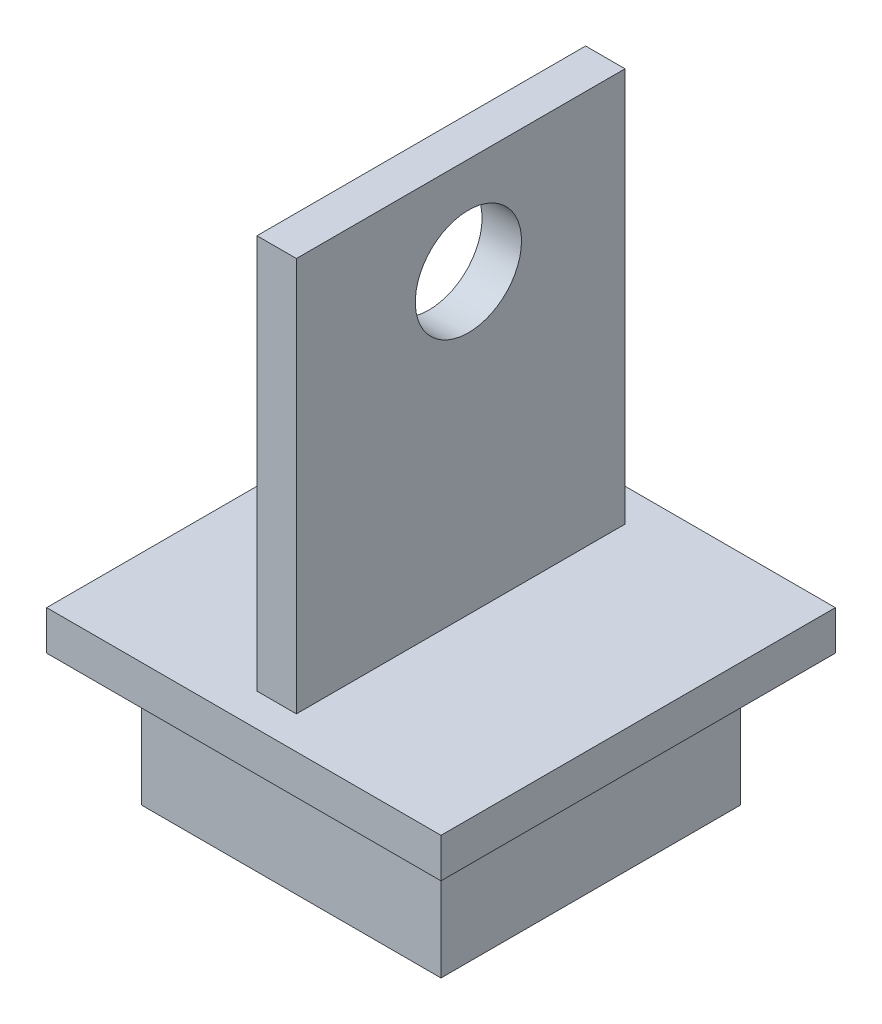
ISO-10303-21;
HEADER;
FILE_DESCRIPTION(('STEP AP214'),'2;1');
FILE_NAME('part.step','',(''),(''),'','','');
FILE_SCHEMA(('AUTOMOTIVE_DESIGN { 1 0 10303 214 1 1 1 1 }'));
ENDSEC;
DATA;
#1=APPLICATION_CONTEXT('core data for automotive mechanical design processes');
#2=APPLICATION_PROTOCOL_DEFINITION('international standard','automotive_design',2000,#1);
#3=PRODUCT_CONTEXT('',#1,'mechanical');
#4=PRODUCT('Part','Part','',(#3));
#5=PRODUCT_RELATED_PRODUCT_CATEGORY('part','',(#4));
#6=PRODUCT_DEFINITION_FORMATION('','',#4);
#7=PRODUCT_DEFINITION_CONTEXT('part definition',#1,'design');
#8=PRODUCT_DEFINITION('design','',#6,#7);
#9=PRODUCT_DEFINITION_SHAPE('','',#8);
#10=(LENGTH_UNIT() NAMED_UNIT(*) SI_UNIT(.MILLI.,.METRE.));
#11=(NAMED_UNIT(*) PLANE_ANGLE_UNIT() SI_UNIT($,.RADIAN.));
#12=(NAMED_UNIT(*) SI_UNIT($,.STERADIAN.) SOLID_ANGLE_UNIT());
#13=UNCERTAINTY_MEASURE_WITH_UNIT(LENGTH_MEASURE(1.E-05),#10,'distance_accuracy_value','');
#14=(GEOMETRIC_REPRESENTATION_CONTEXT(3) GLOBAL_UNCERTAINTY_ASSIGNED_CONTEXT((#13)) GLOBAL_UNIT_ASSIGNED_CONTEXT((#10,
#11,#12)) REPRESENTATION_CONTEXT('',''));
#15=CARTESIAN_POINT('',(0.,0.,0.));
#16=DIRECTION('',(0.,0.,1.));
#17=DIRECTION('',(1.,0.,0.));
#18=AXIS2_PLACEMENT_3D('',#15,#16,#17);
#19=CARTESIAN_POINT('',(0.,0.,0.));
#20=DIRECTION('',(0.,1.,0.));
#21=DIRECTION('',(0.,0.,1.));
#22=AXIS2_PLACEMENT_3D('',#19,#20,#21);
#23=PLANE('',#22);
#24=DIRECTION('',(0.,0.,-1.));
#25=VECTOR('',#24,1.);
#26=CARTESIAN_POINT('',(15.,0.,-15.));
#27=LINE('',#26,#25);
#28=CARTESIAN_POINT('',(15.,0.,15.));
#29=VERTEX_POINT('',#28);
#30=CARTESIAN_POINT('',(15.,0.,-15.));
#31=VERTEX_POINT('',#30);
#32=EDGE_CURVE('E249',#29,#31,#27,.T.);
#33=ORIENTED_EDGE('',*,*,#32,.F.);
#34=DIRECTION('',(1.,0.,0.));
#35=VECTOR('',#34,1.);
#36=CARTESIAN_POINT('',(-15.,0.,15.));
#37=LINE('',#36,#35);
#38=CARTESIAN_POINT('',(-15.,0.,15.));
#39=VERTEX_POINT('',#38);
#40=EDGE_CURVE('E254',#39,#29,#37,.T.);
#41=ORIENTED_EDGE('',*,*,#40,.F.);
#42=DIRECTION('',(0.,0.,1.));
#43=VECTOR('',#42,1.);
#44=CARTESIAN_POINT('',(-15.,0.,-15.));
#45=LINE('',#44,#43);
#46=CARTESIAN_POINT('',(-15.,0.,-15.));
#47=VERTEX_POINT('',#46);
#48=EDGE_CURVE('E265',#47,#39,#45,.T.);
#49=ORIENTED_EDGE('',*,*,#48,.F.);
#50=DIRECTION('',(-1.,0.,0.));
#51=VECTOR('',#50,1.);
#52=CARTESIAN_POINT('',(-15.,0.,-15.));
#53=LINE('',#52,#51);
#54=EDGE_CURVE('E263',#31,#47,#53,.T.);
#55=ORIENTED_EDGE('',*,*,#54,.F.);
#56=EDGE_LOOP('',(#33,#41,#49,#55));
#57=FACE_BOUND('',#56,.T.);
#58=DIRECTION('',(0.,0.,1.));
#59=VECTOR('',#58,1.);
#60=CARTESIAN_POINT('',(11.4,0.,11.4));
#61=LINE('',#60,#59);
#62=CARTESIAN_POINT('',(11.4,0.,-11.4));
#63=VERTEX_POINT('',#62);
#64=CARTESIAN_POINT('',(11.4,0.,11.4));
#65=VERTEX_POINT('',#64);
#66=EDGE_CURVE('E163',#63,#65,#61,.T.);
#67=ORIENTED_EDGE('',*,*,#66,.F.);
#68=DIRECTION('',(1.,0.,0.));
#69=VECTOR('',#68,1.);
#70=CARTESIAN_POINT('',(-11.4,0.,-11.4));
#71=LINE('',#70,#69);
#72=CARTESIAN_POINT('',(-11.4,0.,-11.4));
#73=VERTEX_POINT('',#72);
#74=EDGE_CURVE('E191',#73,#63,#71,.T.);
#75=ORIENTED_EDGE('',*,*,#74,.F.);
#76=DIRECTION('',(0.,0.,-1.));
#77=VECTOR('',#76,1.);
#78=CARTESIAN_POINT('',(-11.4,0.,11.4));
#79=LINE('',#78,#77);
#80=CARTESIAN_POINT('',(-11.4,0.,11.4));
#81=VERTEX_POINT('',#80);
#82=EDGE_CURVE('E53',#81,#73,#79,.T.);
#83=ORIENTED_EDGE('',*,*,#82,.F.);
#84=DIRECTION('',(-1.,0.,0.));
#85=VECTOR('',#84,1.);
#86=CARTESIAN_POINT('',(-11.4,0.,11.4));
#87=LINE('',#86,#85);
#88=EDGE_CURVE('E48',#65,#81,#87,.T.);
#89=ORIENTED_EDGE('',*,*,#88,.F.);
#90=EDGE_LOOP('',(#67,#75,#83,#89));
#91=FACE_BOUND('',#90,.T.);
#92=ADVANCED_FACE('F33',(#57,#91),#23,.F.);
#93=CARTESIAN_POINT('',(0.,3.,0.));
#94=DIRECTION('',(0.,1.,0.));
#95=DIRECTION('',(0.,0.,1.));
#96=AXIS2_PLACEMENT_3D('',#93,#94,#95);
#97=PLANE('',#96);
#98=DIRECTION('',(0.,0.,-1.));
#99=VECTOR('',#98,1.);
#100=CARTESIAN_POINT('',(15.,3.,-15.));
#101=LINE('',#100,#99);
#102=CARTESIAN_POINT('',(15.,3.,15.));
#103=VERTEX_POINT('',#102);
#104=CARTESIAN_POINT('',(15.,3.,-15.));
#105=VERTEX_POINT('',#104);
#106=EDGE_CURVE('E250',#103,#105,#101,.T.);
#107=ORIENTED_EDGE('',*,*,#106,.T.);
#108=DIRECTION('',(-1.,0.,0.));
#109=VECTOR('',#108,1.);
#110=CARTESIAN_POINT('',(-15.,3.,-15.));
#111=LINE('',#110,#109);
#112=CARTESIAN_POINT('',(-15.,3.,-15.));
#113=VERTEX_POINT('',#112);
#114=EDGE_CURVE('E253',#105,#113,#111,.T.);
#115=ORIENTED_EDGE('',*,*,#114,.T.);
#116=DIRECTION('',(0.,0.,1.));
#117=VECTOR('',#116,1.);
#118=CARTESIAN_POINT('',(-15.,3.,-15.));
#119=LINE('',#118,#117);
#120=CARTESIAN_POINT('',(-15.,3.,15.));
#121=VERTEX_POINT('',#120);
#122=EDGE_CURVE('E256',#113,#121,#119,.T.);
#123=ORIENTED_EDGE('',*,*,#122,.T.);
#124=DIRECTION('',(1.,0.,0.));
#125=VECTOR('',#124,1.);
#126=CARTESIAN_POINT('',(-15.,3.,15.));
#127=LINE('',#126,#125);
#128=EDGE_CURVE('E258',#121,#103,#127,.T.);
#129=ORIENTED_EDGE('',*,*,#128,.T.);
#130=EDGE_LOOP('',(#107,#115,#123,#129));
#131=FACE_BOUND('',#130,.T.);
#132=DIRECTION('',(1.,0.,0.));
#133=VECTOR('',#132,1.);
#134=CARTESIAN_POINT('',(-1.5,3.,12.5));
#135=LINE('',#134,#133);
#136=CARTESIAN_POINT('',(-1.5,3.,12.5));
#137=VERTEX_POINT('',#136);
#138=CARTESIAN_POINT('',(1.5,3.,12.5));
#139=VERTEX_POINT('',#138);
#140=EDGE_CURVE('E234',#137,#139,#135,.T.);
#141=ORIENTED_EDGE('',*,*,#140,.F.);
#142=DIRECTION('',(0.,0.,1.));
#143=VECTOR('',#142,1.);
#144=CARTESIAN_POINT('',(-1.5,3.,-12.5));
#145=LINE('',#144,#143);
#146=CARTESIAN_POINT('',(-1.5,3.,-12.5));
#147=VERTEX_POINT('',#146);
#148=EDGE_CURVE('E220',#147,#137,#145,.T.);
#149=ORIENTED_EDGE('',*,*,#148,.F.);
#150=DIRECTION('',(-1.,0.,0.));
#151=VECTOR('',#150,1.);
#152=CARTESIAN_POINT('',(-1.5,3.,-12.5));
#153=LINE('',#152,#151);
#154=CARTESIAN_POINT('',(1.5,3.,-12.5));
#155=VERTEX_POINT('',#154);
#156=EDGE_CURVE('E225',#155,#147,#153,.T.);
#157=ORIENTED_EDGE('',*,*,#156,.F.);
#158=DIRECTION('',(0.,0.,-1.));
#159=VECTOR('',#158,1.);
#160=CARTESIAN_POINT('',(1.5,3.,-12.5));
#161=LINE('',#160,#159);
#162=EDGE_CURVE('E236',#139,#155,#161,.T.);
#163=ORIENTED_EDGE('',*,*,#162,.F.);
#164=EDGE_LOOP('',(#141,#149,#157,#163));
#165=FACE_BOUND('',#164,.T.);
#166=ADVANCED_FACE('F291',(#131,#165),#97,.T.);
#167=CARTESIAN_POINT('',(15.,3.,-15.));
#168=DIRECTION('',(-1.,0.,0.));
#169=DIRECTION('',(0.,0.,1.));
#170=AXIS2_PLACEMENT_3D('',#167,#168,#169);
#171=PLANE('',#170);
#172=ORIENTED_EDGE('',*,*,#32,.T.);
#173=DIRECTION('',(0.,-1.,0.));
#174=VECTOR('',#173,1.);
#175=CARTESIAN_POINT('',(15.,3.,-15.));
#176=LINE('',#175,#174);
#177=EDGE_CURVE('E11',#105,#31,#176,.T.);
#178=ORIENTED_EDGE('',*,*,#177,.F.);
#179=ORIENTED_EDGE('',*,*,#106,.F.);
#180=DIRECTION('',(0.,-1.,0.));
#181=VECTOR('',#180,1.);
#182=CARTESIAN_POINT('',(15.,3.,15.));
#183=LINE('',#182,#181);
#184=EDGE_CURVE('E260',#103,#29,#183,.T.);
#185=ORIENTED_EDGE('',*,*,#184,.T.);
#186=EDGE_LOOP('',(#172,#178,#179,#185));
#187=FACE_BOUND('',#186,.T.);
#188=ADVANCED_FACE('F35',(#187),#171,.F.);
#189=CARTESIAN_POINT('',(-15.,3.,-15.));
#190=DIRECTION('',(0.,0.,1.));
#191=DIRECTION('',(1.,0.,0.));
#192=AXIS2_PLACEMENT_3D('',#189,#190,#191);
#193=PLANE('',#192);
#194=ORIENTED_EDGE('',*,*,#54,.T.);
#195=DIRECTION('',(0.,-1.,0.));
#196=VECTOR('',#195,1.);
#197=CARTESIAN_POINT('',(-15.,3.,-15.));
#198=LINE('',#197,#196);
#199=EDGE_CURVE('E41',#113,#47,#198,.T.);
#200=ORIENTED_EDGE('',*,*,#199,.F.);
#201=ORIENTED_EDGE('',*,*,#114,.F.);
#202=ORIENTED_EDGE('',*,*,#177,.T.);
#203=EDGE_LOOP('',(#194,#200,#201,#202));
#204=FACE_BOUND('',#203,.T.);
#205=ADVANCED_FACE('F293',(#204),#193,.F.);
#206=CARTESIAN_POINT('',(-15.,3.,-15.));
#207=DIRECTION('',(1.,0.,0.));
#208=DIRECTION('',(0.,0.,-1.));
#209=AXIS2_PLACEMENT_3D('',#206,#207,#208);
#210=PLANE('',#209);
#211=ORIENTED_EDGE('',*,*,#48,.T.);
#212=DIRECTION('',(0.,-1.,0.));
#213=VECTOR('',#212,1.);
#214=CARTESIAN_POINT('',(-15.,3.,15.));
#215=LINE('',#214,#213);
#216=EDGE_CURVE('E270',#121,#39,#215,.T.);
#217=ORIENTED_EDGE('',*,*,#216,.F.);
#218=ORIENTED_EDGE('',*,*,#122,.F.);
#219=ORIENTED_EDGE('',*,*,#199,.T.);
#220=EDGE_LOOP('',(#211,#217,#218,#219));
#221=FACE_BOUND('',#220,.T.);
#222=ADVANCED_FACE('F277',(#221),#210,.F.);
#223=CARTESIAN_POINT('',(-15.,3.,15.));
#224=DIRECTION('',(0.,0.,-1.));
#225=DIRECTION('',(-1.,0.,0.));
#226=AXIS2_PLACEMENT_3D('',#223,#224,#225);
#227=PLANE('',#226);
#228=ORIENTED_EDGE('',*,*,#40,.T.);
#229=ORIENTED_EDGE('',*,*,#184,.F.);
#230=ORIENTED_EDGE('',*,*,#128,.F.);
#231=ORIENTED_EDGE('',*,*,#216,.T.);
#232=EDGE_LOOP('',(#228,#229,#230,#231));
#233=FACE_BOUND('',#232,.T.);
#234=ADVANCED_FACE('F285',(#233),#227,.F.);
#235=CARTESIAN_POINT('',(-1.5,33.,-12.5));
#236=DIRECTION('',(1.,0.,0.));
#237=DIRECTION('',(0.,0.,-1.));
#238=AXIS2_PLACEMENT_3D('',#235,#236,#237);
#239=PLANE('',#238);
#240=CARTESIAN_POINT('',(-1.5,25.6037384218644,-0.584677197977612));
#241=DIRECTION('',(1.,0.,0.));
#242=DIRECTION('',(0.,0.,-1.));
#243=AXIS2_PLACEMENT_3D('',#240,#241,#242);
#244=CIRCLE('',#243,4.03940720021012);
#245=CARTESIAN_POINT('',(-1.5,25.6037384218644,-4.62408439818773));
#246=VERTEX_POINT('',#245);
#247=EDGE_CURVE('E217',#246,#246,#244,.T.);
#248=ORIENTED_EDGE('',*,*,#247,.T.);
#249=EDGE_LOOP('',(#248));
#250=FACE_BOUND('',#249,.T.);
#251=ORIENTED_EDGE('',*,*,#148,.T.);
#252=DIRECTION('',(0.,-1.,0.));
#253=VECTOR('',#252,1.);
#254=CARTESIAN_POINT('',(-1.5,33.,12.5));
#255=LINE('',#254,#253);
#256=CARTESIAN_POINT('',(-1.5,33.,12.5));
#257=VERTEX_POINT('',#256);
#258=EDGE_CURVE('E247',#257,#137,#255,.T.);
#259=ORIENTED_EDGE('',*,*,#258,.F.);
#260=DIRECTION('',(0.,0.,1.));
#261=VECTOR('',#260,1.);
#262=CARTESIAN_POINT('',(-1.5,33.,-12.5));
#263=LINE('',#262,#261);
#264=CARTESIAN_POINT('',(-1.5,33.,-12.5));
#265=VERTEX_POINT('',#264);
#266=EDGE_CURVE('E221',#265,#257,#263,.T.);
#267=ORIENTED_EDGE('',*,*,#266,.F.);
#268=DIRECTION('',(0.,-1.,0.));
#269=VECTOR('',#268,1.);
#270=CARTESIAN_POINT('',(-1.5,33.,-12.5));
#271=LINE('',#270,#269);
#272=EDGE_CURVE('E231',#265,#147,#271,.T.);
#273=ORIENTED_EDGE('',*,*,#272,.T.);
#274=EDGE_LOOP('',(#251,#259,#267,#273));
#275=FACE_BOUND('',#274,.T.);
#276=ADVANCED_FACE('F367',(#250,#275),#239,.F.);
#277=CARTESIAN_POINT('',(-1.5,33.,12.5));
#278=DIRECTION('',(0.,0.,-1.));
#279=DIRECTION('',(-1.,0.,0.));
#280=AXIS2_PLACEMENT_3D('',#277,#278,#279);
#281=PLANE('',#280);
#282=ORIENTED_EDGE('',*,*,#140,.T.);
#283=DIRECTION('',(0.,-1.,0.));
#284=VECTOR('',#283,1.);
#285=CARTESIAN_POINT('',(1.5,33.,12.5));
#286=LINE('',#285,#284);
#287=CARTESIAN_POINT('',(1.5,33.,12.5));
#288=VERTEX_POINT('',#287);
#289=EDGE_CURVE('E244',#288,#139,#286,.T.);
#290=ORIENTED_EDGE('',*,*,#289,.F.);
#291=DIRECTION('',(1.,0.,0.));
#292=VECTOR('',#291,1.);
#293=CARTESIAN_POINT('',(-1.5,33.,12.5));
#294=LINE('',#293,#292);
#295=EDGE_CURVE('E224',#257,#288,#294,.T.);
#296=ORIENTED_EDGE('',*,*,#295,.F.);
#297=ORIENTED_EDGE('',*,*,#258,.T.);
#298=EDGE_LOOP('',(#282,#290,#296,#297));
#299=FACE_BOUND('',#298,.T.);
#300=ADVANCED_FACE('F363',(#299),#281,.F.);
#301=CARTESIAN_POINT('',(1.5,33.,-12.5));
#302=DIRECTION('',(-1.,0.,0.));
#303=DIRECTION('',(0.,0.,1.));
#304=AXIS2_PLACEMENT_3D('',#301,#302,#303);
#305=PLANE('',#304);
#306=CARTESIAN_POINT('',(1.5,25.6037384218644,-0.584677197977612));
#307=DIRECTION('',(1.,0.,0.));
#308=DIRECTION('',(0.,0.,-1.));
#309=AXIS2_PLACEMENT_3D('',#306,#307,#308);
#310=CIRCLE('',#309,4.03940720021012);
#311=CARTESIAN_POINT('',(1.5,25.6037384218644,-4.62408439818773));
#312=VERTEX_POINT('',#311);
#313=EDGE_CURVE('E214',#312,#312,#310,.T.);
#314=ORIENTED_EDGE('',*,*,#313,.F.);
#315=EDGE_LOOP('',(#314));
#316=FACE_BOUND('',#315,.T.);
#317=ORIENTED_EDGE('',*,*,#162,.T.);
#318=DIRECTION('',(0.,-1.,0.));
#319=VECTOR('',#318,1.);
#320=CARTESIAN_POINT('',(1.5,33.,-12.5));
#321=LINE('',#320,#319);
#322=CARTESIAN_POINT('',(1.5,33.,-12.5));
#323=VERTEX_POINT('',#322);
#324=EDGE_CURVE('E242',#323,#155,#321,.T.);
#325=ORIENTED_EDGE('',*,*,#324,.F.);
#326=DIRECTION('',(0.,0.,-1.));
#327=VECTOR('',#326,1.);
#328=CARTESIAN_POINT('',(1.5,33.,-12.5));
#329=LINE('',#328,#327);
#330=EDGE_CURVE('E227',#288,#323,#329,.T.);
#331=ORIENTED_EDGE('',*,*,#330,.F.);
#332=ORIENTED_EDGE('',*,*,#289,.T.);
#333=EDGE_LOOP('',(#317,#325,#331,#332));
#334=FACE_BOUND('',#333,.T.);
#335=ADVANCED_FACE('F359',(#316,#334),#305,.F.);
#336=CARTESIAN_POINT('',(-1.5,33.,-12.5));
#337=DIRECTION('',(0.,0.,1.));
#338=DIRECTION('',(1.,0.,0.));
#339=AXIS2_PLACEMENT_3D('',#336,#337,#338);
#340=PLANE('',#339);
#341=ORIENTED_EDGE('',*,*,#156,.T.);
#342=ORIENTED_EDGE('',*,*,#272,.F.);
#343=DIRECTION('',(-1.,0.,0.));
#344=VECTOR('',#343,1.);
#345=CARTESIAN_POINT('',(-1.5,33.,-12.5));
#346=LINE('',#345,#344);
#347=EDGE_CURVE('E229',#323,#265,#346,.T.);
#348=ORIENTED_EDGE('',*,*,#347,.F.);
#349=ORIENTED_EDGE('',*,*,#324,.T.);
#350=EDGE_LOOP('',(#341,#342,#348,#349));
#351=FACE_BOUND('',#350,.T.);
#352=ADVANCED_FACE('F355',(#351),#340,.F.);
#353=CARTESIAN_POINT('',(0.,33.,0.));
#354=DIRECTION('',(0.,1.,0.));
#355=DIRECTION('',(0.,0.,1.));
#356=AXIS2_PLACEMENT_3D('',#353,#354,#355);
#357=PLANE('',#356);
#358=ORIENTED_EDGE('',*,*,#266,.T.);
#359=ORIENTED_EDGE('',*,*,#295,.T.);
#360=ORIENTED_EDGE('',*,*,#330,.T.);
#361=ORIENTED_EDGE('',*,*,#347,.T.);
#362=EDGE_LOOP('',(#358,#359,#360,#361));
#363=FACE_BOUND('',#362,.T.);
#364=ADVANCED_FACE('F351',(#363),#357,.T.);
#365=CARTESIAN_POINT('',(-8.5,25.6037384218644,-0.584677197977611));
#366=DIRECTION('',(1.,0.,0.));
#367=DIRECTION('',(0.,0.,-1.));
#368=AXIS2_PLACEMENT_3D('',#365,#366,#367);
#369=CYLINDRICAL_SURFACE('',#368,4.03940720021012);
#370=ORIENTED_EDGE('',*,*,#313,.T.);
#371=EDGE_LOOP('',(#370));
#372=FACE_BOUND('',#371,.T.);
#373=ORIENTED_EDGE('',*,*,#247,.F.);
#374=EDGE_LOOP('',(#373));
#375=FACE_BOUND('',#374,.T.);
#376=ADVANCED_FACE('F333',(#372,#375),#369,.F.);
#377=CARTESIAN_POINT('',(0.,-10.,0.));
#378=DIRECTION('',(0.,-1.,0.));
#379=DIRECTION('',(0.,0.,-1.));
#380=AXIS2_PLACEMENT_3D('',#377,#378,#379);
#381=PLANE('',#380);
#382=DIRECTION('',(0.,0.,1.));
#383=VECTOR('',#382,1.);
#384=CARTESIAN_POINT('',(11.4,-10.,11.4));
#385=LINE('',#384,#383);
#386=CARTESIAN_POINT('',(11.4,-10.,-11.4));
#387=VERTEX_POINT('',#386);
#388=CARTESIAN_POINT('',(11.4,-10.,11.4));
#389=VERTEX_POINT('',#388);
#390=EDGE_CURVE('E187',#387,#389,#385,.T.);
#391=ORIENTED_EDGE('',*,*,#390,.T.);
#392=DIRECTION('',(-1.,0.,0.));
#393=VECTOR('',#392,1.);
#394=CARTESIAN_POINT('',(-11.4,-10.,11.4));
#395=LINE('',#394,#393);
#396=CARTESIAN_POINT('',(-11.4,-10.,11.4));
#397=VERTEX_POINT('',#396);
#398=EDGE_CURVE('E190',#389,#397,#395,.T.);
#399=ORIENTED_EDGE('',*,*,#398,.T.);
#400=DIRECTION('',(0.,0.,-1.));
#401=VECTOR('',#400,1.);
#402=CARTESIAN_POINT('',(-11.4,-10.,11.4));
#403=LINE('',#402,#401);
#404=CARTESIAN_POINT('',(-11.4,-10.,-11.4));
#405=VERTEX_POINT('',#404);
#406=EDGE_CURVE('E193',#397,#405,#403,.T.);
#407=ORIENTED_EDGE('',*,*,#406,.T.);
#408=DIRECTION('',(1.,0.,0.));
#409=VECTOR('',#408,1.);
#410=CARTESIAN_POINT('',(-11.4,-10.,-11.4));
#411=LINE('',#410,#409);
#412=EDGE_CURVE('E195',#405,#387,#411,.T.);
#413=ORIENTED_EDGE('',*,*,#412,.T.);
#414=EDGE_LOOP('',(#391,#399,#407,#413));
#415=FACE_BOUND('',#414,.T.);
#416=DIRECTION('',(-1.,0.,0.));
#417=VECTOR('',#416,1.);
#418=CARTESIAN_POINT('',(-8.40000000000001,-10.,8.4));
#419=LINE('',#418,#417);
#420=CARTESIAN_POINT('',(8.40000000000001,-10.,8.4));
#421=VERTEX_POINT('',#420);
#422=CARTESIAN_POINT('',(-8.40000000000001,-10.,8.4));
#423=VERTEX_POINT('',#422);
#424=EDGE_CURVE('E155',#421,#423,#419,.T.);
#425=ORIENTED_EDGE('',*,*,#424,.F.);
#426=DIRECTION('',(0.,0.,1.));
#427=VECTOR('',#426,1.);
#428=CARTESIAN_POINT('',(8.40000000000001,-10.,8.4));
#429=LINE('',#428,#427);
#430=CARTESIAN_POINT('',(8.40000000000001,-10.,-8.4));
#431=VERTEX_POINT('',#430);
#432=EDGE_CURVE('E145',#431,#421,#429,.T.);
#433=ORIENTED_EDGE('',*,*,#432,.F.);
#434=DIRECTION('',(1.,0.,0.));
#435=VECTOR('',#434,1.);
#436=CARTESIAN_POINT('',(-8.40000000000001,-10.,-8.4));
#437=LINE('',#436,#435);
#438=CARTESIAN_POINT('',(-8.40000000000001,-10.,-8.4));
#439=VERTEX_POINT('',#438);
#440=EDGE_CURVE('E171',#439,#431,#437,.T.);
#441=ORIENTED_EDGE('',*,*,#440,.F.);
#442=DIRECTION('',(0.,0.,-1.));
#443=VECTOR('',#442,1.);
#444=CARTESIAN_POINT('',(-8.40000000000001,-10.,8.4));
#445=LINE('',#444,#443);
#446=EDGE_CURVE('E169',#423,#439,#445,.T.);
#447=ORIENTED_EDGE('',*,*,#446,.F.);
#448=EDGE_LOOP('',(#425,#433,#441,#447));
#449=FACE_BOUND('',#448,.T.);
#450=ADVANCED_FACE('F167',(#415,#449),#381,.T.);
#451=CARTESIAN_POINT('',(11.4,-10.,11.4));
#452=DIRECTION('',(-1.,0.,0.));
#453=DIRECTION('',(0.,0.,1.));
#454=AXIS2_PLACEMENT_3D('',#451,#452,#453);
#455=PLANE('',#454);
#456=ORIENTED_EDGE('',*,*,#66,.T.);
#457=DIRECTION('',(0.,1.,0.));
#458=VECTOR('',#457,1.);
#459=CARTESIAN_POINT('',(11.4,-10.,11.4));
#460=LINE('',#459,#458);
#461=EDGE_CURVE('E212',#389,#65,#460,.T.);
#462=ORIENTED_EDGE('',*,*,#461,.F.);
#463=ORIENTED_EDGE('',*,*,#390,.F.);
#464=DIRECTION('',(0.,1.,0.));
#465=VECTOR('',#464,1.);
#466=CARTESIAN_POINT('',(11.4,-10.,-11.4));
#467=LINE('',#466,#465);
#468=EDGE_CURVE('E197',#387,#63,#467,.T.);
#469=ORIENTED_EDGE('',*,*,#468,.T.);
#470=EDGE_LOOP('',(#456,#462,#463,#469));
#471=FACE_BOUND('',#470,.T.);
#472=ADVANCED_FACE('F332',(#471),#455,.F.);
#473=CARTESIAN_POINT('',(-11.4,-10.,11.4));
#474=DIRECTION('',(0.,0.,-1.));
#475=DIRECTION('',(-1.,0.,0.));
#476=AXIS2_PLACEMENT_3D('',#473,#474,#475);
#477=PLANE('',#476);
#478=ORIENTED_EDGE('',*,*,#88,.T.);
#479=DIRECTION('',(0.,1.,0.));
#480=VECTOR('',#479,1.);
#481=CARTESIAN_POINT('',(-11.4,-10.,11.4));
#482=LINE('',#481,#480);
#483=EDGE_CURVE('E209',#397,#81,#482,.T.);
#484=ORIENTED_EDGE('',*,*,#483,.F.);
#485=ORIENTED_EDGE('',*,*,#398,.F.);
#486=ORIENTED_EDGE('',*,*,#461,.T.);
#487=EDGE_LOOP('',(#478,#484,#485,#486));
#488=FACE_BOUND('',#487,.T.);
#489=ADVANCED_FACE('F341',(#488),#477,.F.);
#490=CARTESIAN_POINT('',(-11.4,-10.,11.4));
#491=DIRECTION('',(1.,0.,0.));
#492=DIRECTION('',(0.,0.,-1.));
#493=AXIS2_PLACEMENT_3D('',#490,#491,#492);
#494=PLANE('',#493);
#495=ORIENTED_EDGE('',*,*,#82,.T.);
#496=DIRECTION('',(0.,1.,0.));
#497=VECTOR('',#496,1.);
#498=CARTESIAN_POINT('',(-11.4,-10.,-11.4));
#499=LINE('',#498,#497);
#500=EDGE_CURVE('E206',#405,#73,#499,.T.);
#501=ORIENTED_EDGE('',*,*,#500,.F.);
#502=ORIENTED_EDGE('',*,*,#406,.F.);
#503=ORIENTED_EDGE('',*,*,#483,.T.);
#504=EDGE_LOOP('',(#495,#501,#502,#503));
#505=FACE_BOUND('',#504,.T.);
#506=ADVANCED_FACE('F337',(#505),#494,.F.);
#507=CARTESIAN_POINT('',(-11.4,-10.,-11.4));
#508=DIRECTION('',(0.,0.,1.));
#509=DIRECTION('',(1.,0.,0.));
#510=AXIS2_PLACEMENT_3D('',#507,#508,#509);
#511=PLANE('',#510);
#512=ORIENTED_EDGE('',*,*,#74,.T.);
#513=ORIENTED_EDGE('',*,*,#468,.F.);
#514=ORIENTED_EDGE('',*,*,#412,.F.);
#515=ORIENTED_EDGE('',*,*,#500,.T.);
#516=EDGE_LOOP('',(#512,#513,#514,#515));
#517=FACE_BOUND('',#516,.T.);
#518=ADVANCED_FACE('F329',(#517),#511,.F.);
#519=CARTESIAN_POINT('',(8.40000000000001,-10.,8.4));
#520=DIRECTION('',(-1.,0.,0.));
#521=DIRECTION('',(0.,0.,1.));
#522=AXIS2_PLACEMENT_3D('',#519,#520,#521);
#523=PLANE('',#522);
#524=DIRECTION('',(0.,0.,1.));
#525=VECTOR('',#524,1.);
#526=CARTESIAN_POINT('',(8.40000000000001,0.,8.4));
#527=LINE('',#526,#525);
#528=CARTESIAN_POINT('',(8.40000000000001,0.,-8.4));
#529=VERTEX_POINT('',#528);
#530=CARTESIAN_POINT('',(8.40000000000001,0.,8.4));
#531=VERTEX_POINT('',#530);
#532=EDGE_CURVE('E175',#529,#531,#527,.T.);
#533=ORIENTED_EDGE('',*,*,#532,.F.);
#534=DIRECTION('',(0.,1.,0.));
#535=VECTOR('',#534,1.);
#536=CARTESIAN_POINT('',(8.40000000000001,-10.,-8.4));
#537=LINE('',#536,#535);
#538=EDGE_CURVE('E151',#431,#529,#537,.T.);
#539=ORIENTED_EDGE('',*,*,#538,.F.);
#540=ORIENTED_EDGE('',*,*,#432,.T.);
#541=DIRECTION('',(0.,1.,0.));
#542=VECTOR('',#541,1.);
#543=CARTESIAN_POINT('',(8.40000000000001,-10.,8.4));
#544=LINE('',#543,#542);
#545=EDGE_CURVE('E149',#421,#531,#544,.T.);
#546=ORIENTED_EDGE('',*,*,#545,.T.);
#547=EDGE_LOOP('',(#533,#539,#540,#546));
#548=FACE_BOUND('',#547,.T.);
#549=ADVANCED_FACE('F148',(#548),#523,.T.);
#550=CARTESIAN_POINT('',(-8.40000000000001,-10.,8.4));
#551=DIRECTION('',(0.,0.,-1.));
#552=DIRECTION('',(-1.,0.,0.));
#553=AXIS2_PLACEMENT_3D('',#550,#551,#552);
#554=PLANE('',#553);
#555=DIRECTION('',(-1.,0.,0.));
#556=VECTOR('',#555,1.);
#557=CARTESIAN_POINT('',(-8.40000000000001,0.,8.4));
#558=LINE('',#557,#556);
#559=CARTESIAN_POINT('',(-8.40000000000001,0.,8.4));
#560=VERTEX_POINT('',#559);
#561=EDGE_CURVE('E162',#531,#560,#558,.T.);
#562=ORIENTED_EDGE('',*,*,#561,.F.);
#563=ORIENTED_EDGE('',*,*,#545,.F.);
#564=ORIENTED_EDGE('',*,*,#424,.T.);
#565=DIRECTION('',(0.,1.,0.));
#566=VECTOR('',#565,1.);
#567=CARTESIAN_POINT('',(-8.40000000000001,-10.,8.4));
#568=LINE('',#567,#566);
#569=EDGE_CURVE('E164',#423,#560,#568,.T.);
#570=ORIENTED_EDGE('',*,*,#569,.T.);
#571=EDGE_LOOP('',(#562,#563,#564,#570));
#572=FACE_BOUND('',#571,.T.);
#573=ADVANCED_FACE('F159',(#572),#554,.T.);
#574=CARTESIAN_POINT('',(-8.40000000000001,-10.,8.4));
#575=DIRECTION('',(1.,0.,0.));
#576=DIRECTION('',(0.,0.,-1.));
#577=AXIS2_PLACEMENT_3D('',#574,#575,#576);
#578=PLANE('',#577);
#579=DIRECTION('',(0.,0.,-1.));
#580=VECTOR('',#579,1.);
#581=CARTESIAN_POINT('',(-8.40000000000001,0.,8.4));
#582=LINE('',#581,#580);
#583=CARTESIAN_POINT('',(-8.40000000000001,0.,-8.4));
#584=VERTEX_POINT('',#583);
#585=EDGE_CURVE('E178',#560,#584,#582,.T.);
#586=ORIENTED_EDGE('',*,*,#585,.F.);
#587=ORIENTED_EDGE('',*,*,#569,.F.);
#588=ORIENTED_EDGE('',*,*,#446,.T.);
#589=DIRECTION('',(0.,1.,0.));
#590=VECTOR('',#589,1.);
#591=CARTESIAN_POINT('',(-8.40000000000001,-10.,-8.4));
#592=LINE('',#591,#590);
#593=EDGE_CURVE('E184',#439,#584,#592,.T.);
#594=ORIENTED_EDGE('',*,*,#593,.T.);
#595=EDGE_LOOP('',(#586,#587,#588,#594));
#596=FACE_BOUND('',#595,.T.);
#597=ADVANCED_FACE('F314',(#596),#578,.T.);
#598=CARTESIAN_POINT('',(-8.40000000000001,-10.,-8.4));
#599=DIRECTION('',(0.,0.,1.));
#600=DIRECTION('',(1.,0.,0.));
#601=AXIS2_PLACEMENT_3D('',#598,#599,#600);
#602=PLANE('',#601);
#603=DIRECTION('',(1.,0.,0.));
#604=VECTOR('',#603,1.);
#605=CARTESIAN_POINT('',(-8.40000000000001,0.,-8.4));
#606=LINE('',#605,#604);
#607=EDGE_CURVE('E156',#584,#529,#606,.T.);
#608=ORIENTED_EDGE('',*,*,#607,.F.);
#609=ORIENTED_EDGE('',*,*,#593,.F.);
#610=ORIENTED_EDGE('',*,*,#440,.T.);
#611=ORIENTED_EDGE('',*,*,#538,.T.);
#612=EDGE_LOOP('',(#608,#609,#610,#611));
#613=FACE_BOUND('',#612,.T.);
#614=ADVANCED_FACE('F309',(#613),#602,.T.);
#615=ORIENTED_EDGE('',*,*,#607,.T.);
#616=ORIENTED_EDGE('',*,*,#532,.T.);
#617=ORIENTED_EDGE('',*,*,#561,.T.);
#618=ORIENTED_EDGE('',*,*,#585,.T.);
#619=EDGE_LOOP('',(#615,#616,#617,#618));
#620=FACE_BOUND('',#619,.T.);
#621=ADVANCED_FACE('F302',(#620),#23,.F.);
#622=CLOSED_SHELL('',(#92,#166,#188,#205,#222,#234,#276,#300,#335,#352,#364,#376,#450,#472,#489,
#506,#518,#549,#573,#597,#614,#621));
#623=MANIFOLD_SOLID_BREP('B2',#622);
#624=ADVANCED_BREP_SHAPE_REPRESENTATION('',(#18,#623),#14);
#625=SHAPE_DEFINITION_REPRESENTATION(#9,#624);
ENDSEC;
END-ISO-10303-21;
